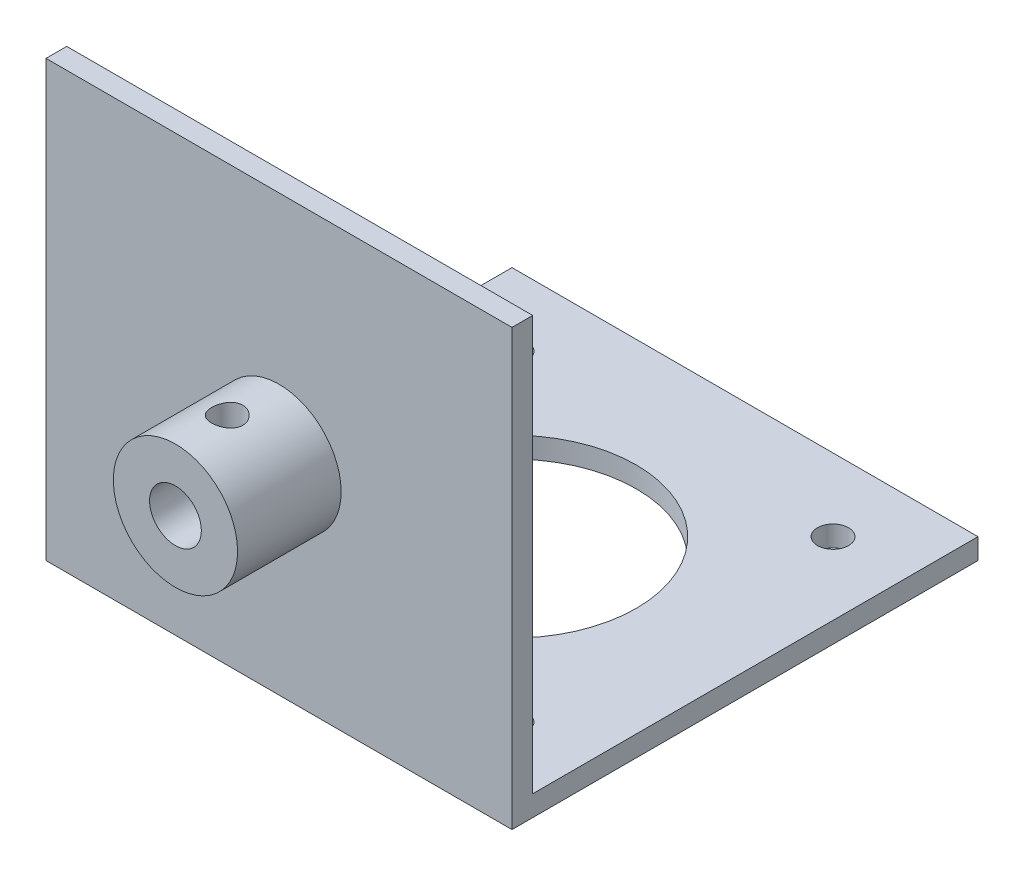
ISO-10303-21;
HEADER;
FILE_DESCRIPTION(('STEP AP214'),'2;1');
FILE_NAME('part.step','',(''),(''),'','','');
FILE_SCHEMA(('AUTOMOTIVE_DESIGN { 1 0 10303 214 1 1 1 1 }'));
ENDSEC;
DATA;
#1=APPLICATION_CONTEXT('core data for automotive mechanical design processes');
#2=APPLICATION_PROTOCOL_DEFINITION('international standard','automotive_design',2000,#1);
#3=PRODUCT_CONTEXT('',#1,'mechanical');
#4=PRODUCT('Part','Part','',(#3));
#5=PRODUCT_RELATED_PRODUCT_CATEGORY('part','',(#4));
#6=PRODUCT_DEFINITION_FORMATION('','',#4);
#7=PRODUCT_DEFINITION_CONTEXT('part definition',#1,'design');
#8=PRODUCT_DEFINITION('design','',#6,#7);
#9=PRODUCT_DEFINITION_SHAPE('','',#8);
#10=(LENGTH_UNIT() NAMED_UNIT(*) SI_UNIT(.MILLI.,.METRE.));
#11=(NAMED_UNIT(*) PLANE_ANGLE_UNIT() SI_UNIT($,.RADIAN.));
#12=(NAMED_UNIT(*) SI_UNIT($,.STERADIAN.) SOLID_ANGLE_UNIT());
#13=UNCERTAINTY_MEASURE_WITH_UNIT(LENGTH_MEASURE(1.E-05),#10,'distance_accuracy_value','');
#14=(GEOMETRIC_REPRESENTATION_CONTEXT(3) GLOBAL_UNCERTAINTY_ASSIGNED_CONTEXT((#13)) GLOBAL_UNIT_ASSIGNED_CONTEXT((#10,
#11,#12)) REPRESENTATION_CONTEXT('',''));
#15=CARTESIAN_POINT('',(0.,0.,0.));
#16=DIRECTION('',(0.,0.,1.));
#17=DIRECTION('',(1.,0.,0.));
#18=AXIS2_PLACEMENT_3D('',#15,#16,#17);
#19=CARTESIAN_POINT('',(0.,2.,-45.));
#20=DIRECTION('',(0.,0.,-1.));
#21=DIRECTION('',(-1.,0.,0.));
#22=AXIS2_PLACEMENT_3D('',#19,#20,#21);
#23=PLANE('',#22);
#24=DIRECTION('',(1.,0.,0.));
#25=VECTOR('',#24,1.);
#26=CARTESIAN_POINT('',(0.,0.,-45.));
#27=LINE('',#26,#25);
#28=CARTESIAN_POINT('',(0.,0.,-45.));
#29=VERTEX_POINT('',#28);
#30=CARTESIAN_POINT('',(45.,0.,-45.));
#31=VERTEX_POINT('',#30);
#32=EDGE_CURVE('E99',#29,#31,#27,.T.);
#33=ORIENTED_EDGE('',*,*,#32,.F.);
#34=DIRECTION('',(0.,-1.,0.));
#35=VECTOR('',#34,1.);
#36=CARTESIAN_POINT('',(0.,2.,-45.));
#37=LINE('',#36,#35);
#38=CARTESIAN_POINT('',(0.,2.,-45.));
#39=VERTEX_POINT('',#38);
#40=EDGE_CURVE('E55',#39,#29,#37,.T.);
#41=ORIENTED_EDGE('',*,*,#40,.F.);
#42=DIRECTION('',(1.,0.,0.));
#43=VECTOR('',#42,1.);
#44=CARTESIAN_POINT('',(0.,2.,-45.));
#45=LINE('',#44,#43);
#46=CARTESIAN_POINT('',(45.,2.,-45.));
#47=VERTEX_POINT('',#46);
#48=EDGE_CURVE('E113',#39,#47,#45,.T.);
#49=ORIENTED_EDGE('',*,*,#48,.T.);
#50=DIRECTION('',(0.,-1.,0.));
#51=VECTOR('',#50,1.);
#52=CARTESIAN_POINT('',(45.,2.,-45.));
#53=LINE('',#52,#51);
#54=EDGE_CURVE('E101',#47,#31,#53,.T.);
#55=ORIENTED_EDGE('',*,*,#54,.T.);
#56=EDGE_LOOP('',(#33,#41,#49,#55));
#57=FACE_BOUND('',#56,.T.);
#58=ADVANCED_FACE('F41',(#57),#23,.T.);
#59=CARTESIAN_POINT('',(0.,2.,0.));
#60=DIRECTION('',(-1.,0.,0.));
#61=DIRECTION('',(0.,0.,1.));
#62=AXIS2_PLACEMENT_3D('',#59,#60,#61);
#63=PLANE('',#62);
#64=DIRECTION('',(0.,0.,-1.));
#65=VECTOR('',#64,1.);
#66=CARTESIAN_POINT('',(0.,0.,0.));
#67=LINE('',#66,#65);
#68=CARTESIAN_POINT('',(0.,0.,0.));
#69=VERTEX_POINT('',#68);
#70=EDGE_CURVE('E91',#69,#29,#67,.T.);
#71=ORIENTED_EDGE('',*,*,#70,.F.);
#72=DIRECTION('',(0.,-1.,0.));
#73=VECTOR('',#72,1.);
#74=CARTESIAN_POINT('',(0.,2.,0.));
#75=LINE('',#74,#73);
#76=CARTESIAN_POINT('',(0.,42.,0.));
#77=VERTEX_POINT('',#76);
#78=EDGE_CURVE('E96',#77,#69,#75,.T.);
#79=ORIENTED_EDGE('',*,*,#78,.F.);
#80=DIRECTION('',(0.,0.,1.));
#81=VECTOR('',#80,1.);
#82=CARTESIAN_POINT('',(0.,42.,0.));
#83=LINE('',#82,#81);
#84=CARTESIAN_POINT('',(0.,42.,-2.));
#85=VERTEX_POINT('',#84);
#86=EDGE_CURVE('E351',#85,#77,#83,.T.);
#87=ORIENTED_EDGE('',*,*,#86,.F.);
#88=DIRECTION('',(0.,-1.,0.));
#89=VECTOR('',#88,1.);
#90=CARTESIAN_POINT('',(0.,42.,-2.));
#91=LINE('',#90,#89);
#92=CARTESIAN_POINT('',(0.,2.,-2.));
#93=VERTEX_POINT('',#92);
#94=EDGE_CURVE('E348',#85,#93,#91,.T.);
#95=ORIENTED_EDGE('',*,*,#94,.T.);
#96=DIRECTION('',(0.,0.,-1.));
#97=VECTOR('',#96,1.);
#98=CARTESIAN_POINT('',(0.,2.,0.));
#99=LINE('',#98,#97);
#100=EDGE_CURVE('E71',#93,#39,#99,.T.);
#101=ORIENTED_EDGE('',*,*,#100,.T.);
#102=ORIENTED_EDGE('',*,*,#40,.T.);
#103=EDGE_LOOP('',(#71,#79,#87,#95,#101,#102));
#104=FACE_BOUND('',#103,.T.);
#105=ADVANCED_FACE('F88',(#104),#63,.T.);
#106=CARTESIAN_POINT('',(0.,2.,0.));
#107=DIRECTION('',(0.,0.,-1.));
#108=DIRECTION('',(-1.,0.,0.));
#109=AXIS2_PLACEMENT_3D('',#106,#107,#108);
#110=PLANE('',#109);
#111=CARTESIAN_POINT('',(22.5,20.,0.));
#112=DIRECTION('',(0.,0.,1.));
#113=DIRECTION('',(1.,0.,0.));
#114=AXIS2_PLACEMENT_3D('',#111,#112,#113);
#115=CIRCLE('',#114,6.);
#116=CARTESIAN_POINT('',(28.5,20.,0.));
#117=VERTEX_POINT('',#116);
#118=EDGE_CURVE('E11',#117,#117,#115,.T.);
#119=ORIENTED_EDGE('',*,*,#118,.F.);
#120=EDGE_LOOP('',(#119));
#121=FACE_BOUND('',#120,.T.);
#122=DIRECTION('',(1.,0.,0.));
#123=VECTOR('',#122,1.);
#124=CARTESIAN_POINT('',(0.,0.,0.));
#125=LINE('',#124,#123);
#126=CARTESIAN_POINT('',(45.,0.,0.));
#127=VERTEX_POINT('',#126);
#128=EDGE_CURVE('E111',#69,#127,#125,.T.);
#129=ORIENTED_EDGE('',*,*,#128,.T.);
#130=DIRECTION('',(0.,-1.,0.));
#131=VECTOR('',#130,1.);
#132=CARTESIAN_POINT('',(45.,2.,0.));
#133=LINE('',#132,#131);
#134=CARTESIAN_POINT('',(45.,42.,0.));
#135=VERTEX_POINT('',#134);
#136=EDGE_CURVE('E124',#135,#127,#133,.T.);
#137=ORIENTED_EDGE('',*,*,#136,.F.);
#138=DIRECTION('',(1.,0.,0.));
#139=VECTOR('',#138,1.);
#140=CARTESIAN_POINT('',(45.,42.,0.));
#141=LINE('',#140,#139);
#142=EDGE_CURVE('E354',#77,#135,#141,.T.);
#143=ORIENTED_EDGE('',*,*,#142,.F.);
#144=ORIENTED_EDGE('',*,*,#78,.T.);
#145=EDGE_LOOP('',(#129,#137,#143,#144));
#146=FACE_BOUND('',#145,.T.);
#147=ADVANCED_FACE('F224',(#121,#146),#110,.F.);
#148=CARTESIAN_POINT('',(45.,2.,0.));
#149=DIRECTION('',(-1.,0.,0.));
#150=DIRECTION('',(0.,0.,1.));
#151=AXIS2_PLACEMENT_3D('',#148,#149,#150);
#152=PLANE('',#151);
#153=DIRECTION('',(0.,0.,-1.));
#154=VECTOR('',#153,1.);
#155=CARTESIAN_POINT('',(45.,0.,0.));
#156=LINE('',#155,#154);
#157=EDGE_CURVE('E106',#127,#31,#156,.T.);
#158=ORIENTED_EDGE('',*,*,#157,.T.);
#159=ORIENTED_EDGE('',*,*,#54,.F.);
#160=DIRECTION('',(0.,0.,-1.));
#161=VECTOR('',#160,1.);
#162=CARTESIAN_POINT('',(45.,2.,0.));
#163=LINE('',#162,#161);
#164=CARTESIAN_POINT('',(45.,2.,-2.));
#165=VERTEX_POINT('',#164);
#166=EDGE_CURVE('E117',#165,#47,#163,.T.);
#167=ORIENTED_EDGE('',*,*,#166,.F.);
#168=DIRECTION('',(0.,-1.,0.));
#169=VECTOR('',#168,1.);
#170=CARTESIAN_POINT('',(45.,42.,-2.));
#171=LINE('',#170,#169);
#172=CARTESIAN_POINT('',(45.,42.,-2.));
#173=VERTEX_POINT('',#172);
#174=EDGE_CURVE('E334',#173,#165,#171,.T.);
#175=ORIENTED_EDGE('',*,*,#174,.F.);
#176=DIRECTION('',(0.,0.,-1.));
#177=VECTOR('',#176,1.);
#178=CARTESIAN_POINT('',(45.,42.,-2.));
#179=LINE('',#178,#177);
#180=EDGE_CURVE('E317',#135,#173,#179,.T.);
#181=ORIENTED_EDGE('',*,*,#180,.F.);
#182=ORIENTED_EDGE('',*,*,#136,.T.);
#183=EDGE_LOOP('',(#158,#159,#167,#175,#181,#182));
#184=FACE_BOUND('',#183,.T.);
#185=ADVANCED_FACE('F218',(#184),#152,.F.);
#186=CARTESIAN_POINT('',(0.,2.,0.));
#187=DIRECTION('',(0.,1.,0.));
#188=DIRECTION('',(0.,0.,1.));
#189=AXIS2_PLACEMENT_3D('',#186,#187,#188);
#190=PLANE('',#189);
#191=DIRECTION('',(-1.,0.,0.));
#192=VECTOR('',#191,1.);
#193=CARTESIAN_POINT('',(0.,2.,-2.));
#194=LINE('',#193,#192);
#195=EDGE_CURVE('E63',#165,#93,#194,.T.);
#196=ORIENTED_EDGE('',*,*,#195,.F.);
#197=ORIENTED_EDGE('',*,*,#166,.T.);
#198=ORIENTED_EDGE('',*,*,#48,.F.);
#199=ORIENTED_EDGE('',*,*,#100,.F.);
#200=EDGE_LOOP('',(#196,#197,#198,#199));
#201=FACE_BOUND('',#200,.T.);
#202=CARTESIAN_POINT('',(22.5,2.,-22.5));
#203=DIRECTION('',(0.,1.,0.));
#204=DIRECTION('',(0.,0.,1.));
#205=AXIS2_PLACEMENT_3D('',#202,#203,#204);
#206=CIRCLE('',#205,12.);
#207=CARTESIAN_POINT('',(22.5,2.,-10.5));
#208=VERTEX_POINT('',#207);
#209=EDGE_CURVE('E329',#208,#208,#206,.T.);
#210=ORIENTED_EDGE('',*,*,#209,.F.);
#211=EDGE_LOOP('',(#210));
#212=FACE_BOUND('',#211,.T.);
#213=CARTESIAN_POINT('',(7.00000000000001,2.,-7.));
#214=DIRECTION('',(0.,1.,0.));
#215=DIRECTION('',(0.,0.,1.));
#216=AXIS2_PLACEMENT_3D('',#213,#214,#215);
#217=CIRCLE('',#216,1.5);
#218=CARTESIAN_POINT('',(7.00000000000001,2.,-5.5));
#219=VERTEX_POINT('',#218);
#220=EDGE_CURVE('E333',#219,#219,#217,.T.);
#221=ORIENTED_EDGE('',*,*,#220,.F.);
#222=EDGE_LOOP('',(#221));
#223=FACE_BOUND('',#222,.T.);
#224=CARTESIAN_POINT('',(38.,2.,-7.));
#225=DIRECTION('',(0.,1.,0.));
#226=DIRECTION('',(0.,0.,1.));
#227=AXIS2_PLACEMENT_3D('',#224,#225,#226);
#228=CIRCLE('',#227,1.5);
#229=CARTESIAN_POINT('',(38.,2.,-5.49999999999999));
#230=VERTEX_POINT('',#229);
#231=EDGE_CURVE('E338',#230,#230,#228,.T.);
#232=ORIENTED_EDGE('',*,*,#231,.F.);
#233=EDGE_LOOP('',(#232));
#234=FACE_BOUND('',#233,.T.);
#235=CARTESIAN_POINT('',(38.,2.,-38.));
#236=DIRECTION('',(0.,1.,0.));
#237=DIRECTION('',(0.,0.,1.));
#238=AXIS2_PLACEMENT_3D('',#235,#236,#237);
#239=CIRCLE('',#238,1.5);
#240=CARTESIAN_POINT('',(38.,2.,-36.5));
#241=VERTEX_POINT('',#240);
#242=EDGE_CURVE('E328',#241,#241,#239,.T.);
#243=ORIENTED_EDGE('',*,*,#242,.F.);
#244=EDGE_LOOP('',(#243));
#245=FACE_BOUND('',#244,.T.);
#246=CARTESIAN_POINT('',(7.00000000000001,2.,-38.));
#247=DIRECTION('',(0.,1.,0.));
#248=DIRECTION('',(0.,0.,1.));
#249=AXIS2_PLACEMENT_3D('',#246,#247,#248);
#250=CIRCLE('',#249,1.5);
#251=CARTESIAN_POINT('',(7.00000000000001,2.,-36.5));
#252=VERTEX_POINT('',#251);
#253=EDGE_CURVE('E135',#252,#252,#250,.T.);
#254=ORIENTED_EDGE('',*,*,#253,.F.);
#255=EDGE_LOOP('',(#254));
#256=FACE_BOUND('',#255,.T.);
#257=ADVANCED_FACE('F215',(#201,#212,#223,#234,#245,#256),#190,.T.);
#258=CARTESIAN_POINT('',(0.,0.,0.));
#259=DIRECTION('',(0.,1.,0.));
#260=DIRECTION('',(0.,0.,1.));
#261=AXIS2_PLACEMENT_3D('',#258,#259,#260);
#262=PLANE('',#261);
#263=CARTESIAN_POINT('',(22.5,0.,-22.5));
#264=DIRECTION('',(0.,1.,0.));
#265=DIRECTION('',(0.,0.,1.));
#266=AXIS2_PLACEMENT_3D('',#263,#264,#265);
#267=CIRCLE('',#266,12.);
#268=CARTESIAN_POINT('',(22.5,0.,-10.5));
#269=VERTEX_POINT('',#268);
#270=EDGE_CURVE('E107',#269,#269,#267,.T.);
#271=ORIENTED_EDGE('',*,*,#270,.T.);
#272=EDGE_LOOP('',(#271));
#273=FACE_BOUND('',#272,.T.);
#274=CARTESIAN_POINT('',(7.00000000000001,0.,-7.));
#275=DIRECTION('',(0.,1.,0.));
#276=DIRECTION('',(0.,0.,1.));
#277=AXIS2_PLACEMENT_3D('',#274,#275,#276);
#278=CIRCLE('',#277,1.5);
#279=CARTESIAN_POINT('',(7.00000000000001,0.,-5.5));
#280=VERTEX_POINT('',#279);
#281=EDGE_CURVE('E143',#280,#280,#278,.T.);
#282=ORIENTED_EDGE('',*,*,#281,.T.);
#283=EDGE_LOOP('',(#282));
#284=FACE_BOUND('',#283,.T.);
#285=CARTESIAN_POINT('',(38.,0.,-7.));
#286=DIRECTION('',(0.,1.,0.));
#287=DIRECTION('',(0.,0.,1.));
#288=AXIS2_PLACEMENT_3D('',#285,#286,#287);
#289=CIRCLE('',#288,1.5);
#290=CARTESIAN_POINT('',(38.,0.,-5.49999999999999));
#291=VERTEX_POINT('',#290);
#292=EDGE_CURVE('E139',#291,#291,#289,.T.);
#293=ORIENTED_EDGE('',*,*,#292,.T.);
#294=EDGE_LOOP('',(#293));
#295=FACE_BOUND('',#294,.T.);
#296=CARTESIAN_POINT('',(38.,0.,-38.));
#297=DIRECTION('',(0.,1.,0.));
#298=DIRECTION('',(0.,0.,1.));
#299=AXIS2_PLACEMENT_3D('',#296,#297,#298);
#300=CIRCLE('',#299,1.5);
#301=CARTESIAN_POINT('',(38.,0.,-36.5));
#302=VERTEX_POINT('',#301);
#303=EDGE_CURVE('E134',#302,#302,#300,.T.);
#304=ORIENTED_EDGE('',*,*,#303,.T.);
#305=EDGE_LOOP('',(#304));
#306=FACE_BOUND('',#305,.T.);
#307=CARTESIAN_POINT('',(7.00000000000001,0.,-38.));
#308=DIRECTION('',(0.,1.,0.));
#309=DIRECTION('',(0.,0.,1.));
#310=AXIS2_PLACEMENT_3D('',#307,#308,#309);
#311=CIRCLE('',#310,1.5);
#312=CARTESIAN_POINT('',(7.00000000000001,0.,-36.5));
#313=VERTEX_POINT('',#312);
#314=EDGE_CURVE('E130',#313,#313,#311,.T.);
#315=ORIENTED_EDGE('',*,*,#314,.T.);
#316=EDGE_LOOP('',(#315));
#317=FACE_BOUND('',#316,.T.);
#318=ORIENTED_EDGE('',*,*,#32,.T.);
#319=ORIENTED_EDGE('',*,*,#157,.F.);
#320=ORIENTED_EDGE('',*,*,#128,.F.);
#321=ORIENTED_EDGE('',*,*,#70,.T.);
#322=EDGE_LOOP('',(#318,#319,#320,#321));
#323=FACE_BOUND('',#322,.T.);
#324=ADVANCED_FACE('F110',(#273,#284,#295,#306,#317,#323),#262,.F.);
#325=CARTESIAN_POINT('',(7.00000000000001,-8.,-38.));
#326=DIRECTION('',(0.,1.,0.));
#327=DIRECTION('',(0.,0.,1.));
#328=AXIS2_PLACEMENT_3D('',#325,#326,#327);
#329=CYLINDRICAL_SURFACE('',#328,1.5);
#330=ORIENTED_EDGE('',*,*,#253,.T.);
#331=EDGE_LOOP('',(#330));
#332=FACE_BOUND('',#331,.T.);
#333=ORIENTED_EDGE('',*,*,#314,.F.);
#334=EDGE_LOOP('',(#333));
#335=FACE_BOUND('',#334,.T.);
#336=ADVANCED_FACE('F200',(#332,#335),#329,.F.);
#337=CARTESIAN_POINT('',(38.,-8.,-38.));
#338=DIRECTION('',(0.,1.,0.));
#339=DIRECTION('',(0.,0.,1.));
#340=AXIS2_PLACEMENT_3D('',#337,#338,#339);
#341=CYLINDRICAL_SURFACE('',#340,1.5);
#342=ORIENTED_EDGE('',*,*,#242,.T.);
#343=EDGE_LOOP('',(#342));
#344=FACE_BOUND('',#343,.T.);
#345=ORIENTED_EDGE('',*,*,#303,.F.);
#346=EDGE_LOOP('',(#345));
#347=FACE_BOUND('',#346,.T.);
#348=ADVANCED_FACE('F196',(#344,#347),#341,.F.);
#349=CARTESIAN_POINT('',(38.,-8.,-7.));
#350=DIRECTION('',(0.,1.,0.));
#351=DIRECTION('',(0.,0.,1.));
#352=AXIS2_PLACEMENT_3D('',#349,#350,#351);
#353=CYLINDRICAL_SURFACE('',#352,1.5);
#354=ORIENTED_EDGE('',*,*,#231,.T.);
#355=EDGE_LOOP('',(#354));
#356=FACE_BOUND('',#355,.T.);
#357=ORIENTED_EDGE('',*,*,#292,.F.);
#358=EDGE_LOOP('',(#357));
#359=FACE_BOUND('',#358,.T.);
#360=ADVANCED_FACE('F199',(#356,#359),#353,.F.);
#361=CARTESIAN_POINT('',(7.00000000000001,-8.,-7.));
#362=DIRECTION('',(0.,1.,0.));
#363=DIRECTION('',(0.,0.,1.));
#364=AXIS2_PLACEMENT_3D('',#361,#362,#363);
#365=CYLINDRICAL_SURFACE('',#364,1.5);
#366=ORIENTED_EDGE('',*,*,#220,.T.);
#367=EDGE_LOOP('',(#366));
#368=FACE_BOUND('',#367,.T.);
#369=ORIENTED_EDGE('',*,*,#281,.F.);
#370=EDGE_LOOP('',(#369));
#371=FACE_BOUND('',#370,.T.);
#372=ADVANCED_FACE('F204',(#368,#371),#365,.F.);
#373=CARTESIAN_POINT('',(22.5,-8.,-22.5));
#374=DIRECTION('',(0.,1.,0.));
#375=DIRECTION('',(0.,0.,1.));
#376=AXIS2_PLACEMENT_3D('',#373,#374,#375);
#377=CYLINDRICAL_SURFACE('',#376,12.);
#378=ORIENTED_EDGE('',*,*,#209,.T.);
#379=EDGE_LOOP('',(#378));
#380=FACE_BOUND('',#379,.T.);
#381=ORIENTED_EDGE('',*,*,#270,.F.);
#382=EDGE_LOOP('',(#381));
#383=FACE_BOUND('',#382,.T.);
#384=ADVANCED_FACE('F194',(#380,#383),#377,.F.);
#385=CARTESIAN_POINT('',(0.,42.,-2.));
#386=DIRECTION('',(0.,0.,1.));
#387=DIRECTION('',(1.,0.,0.));
#388=AXIS2_PLACEMENT_3D('',#385,#386,#387);
#389=PLANE('',#388);
#390=ORIENTED_EDGE('',*,*,#195,.T.);
#391=ORIENTED_EDGE('',*,*,#94,.F.);
#392=DIRECTION('',(-1.,0.,0.));
#393=VECTOR('',#392,1.);
#394=CARTESIAN_POINT('',(0.,42.,-2.));
#395=LINE('',#394,#393);
#396=EDGE_CURVE('E358',#173,#85,#395,.T.);
#397=ORIENTED_EDGE('',*,*,#396,.F.);
#398=ORIENTED_EDGE('',*,*,#174,.T.);
#399=EDGE_LOOP('',(#390,#391,#397,#398));
#400=FACE_BOUND('',#399,.T.);
#401=ADVANCED_FACE('F190',(#400),#389,.F.);
#402=CARTESIAN_POINT('',(0.,42.,0.));
#403=DIRECTION('',(0.,-1.,0.));
#404=DIRECTION('',(0.,0.,-1.));
#405=AXIS2_PLACEMENT_3D('',#402,#403,#404);
#406=PLANE('',#405);
#407=ORIENTED_EDGE('',*,*,#142,.T.);
#408=ORIENTED_EDGE('',*,*,#180,.T.);
#409=ORIENTED_EDGE('',*,*,#396,.T.);
#410=ORIENTED_EDGE('',*,*,#86,.T.);
#411=EDGE_LOOP('',(#407,#408,#409,#410));
#412=FACE_BOUND('',#411,.T.);
#413=ADVANCED_FACE('F185',(#412),#406,.F.);
#414=CARTESIAN_POINT('',(22.5,20.,10.));
#415=DIRECTION('',(0.,0.,-1.));
#416=DIRECTION('',(-1.,0.,0.));
#417=AXIS2_PLACEMENT_3D('',#414,#415,#416);
#418=CYLINDRICAL_SURFACE('',#417,2.5);
#419=CARTESIAN_POINT('',(22.5,17.5,6.5));
#420=CARTESIAN_POINT('',(22.576729833462,17.5000037421027,6.49999590899012));
#421=CARTESIAN_POINT('',(22.6535823206442,17.5035709538499,6.49407132907374));
#422=CARTESIAN_POINT('',(22.8049755095307,17.5175009639143,6.47067568048467));
#423=CARTESIAN_POINT('',(22.879510034596,17.5278805196728,6.45317613814578));
#424=CARTESIAN_POINT('',(23.0237518277908,17.5543844194551,6.40761363883314));
#425=CARTESIAN_POINT('',(23.0934810282266,17.5704802672706,6.37960304183684));
#426=CARTESIAN_POINT('',(23.2270303182147,17.6070463237359,6.31413966685897));
#427=CARTESIAN_POINT('',(23.2908518694164,17.6275154461975,6.27668923303125));
#428=CARTESIAN_POINT('',(23.4162992789993,17.6729463928091,6.19022517329142));
#429=CARTESIAN_POINT('',(23.4773840200814,17.6981320780402,6.14054630464861));
#430=CARTESIAN_POINT('',(23.5908827041189,17.7496956072037,6.03253279617173));
#431=CARTESIAN_POINT('',(23.6432853494811,17.7760749484643,5.97418706281268));
#432=CARTESIAN_POINT('',(23.7444499676297,17.8308893300409,5.84207648950327));
#433=CARTESIAN_POINT('',(23.7919776637881,17.8591798229635,5.76729822901871));
#434=CARTESIAN_POINT('',(23.873614377649,17.9106169858788,5.60915342675689));
#435=CARTESIAN_POINT('',(23.9077451733516,17.9337719772606,5.52580110375243));
#436=CARTESIAN_POINT('',(23.9544060171422,17.9664537033907,5.37340354934676));
#437=CARTESIAN_POINT('',(23.9701619724683,17.9779211686241,5.30576400138968));
#438=CARTESIAN_POINT('',(23.9921617234047,17.994096917045,5.16819628416964));
#439=CARTESIAN_POINT('',(23.9984173455684,17.9988136035624,5.09827107124551));
#440=CARTESIAN_POINT('',(24.0010550879601,18.0007907753614,4.95798850578267));
#441=CARTESIAN_POINT('',(23.9974178340842,17.9980366298728,4.8876305749068));
#442=CARTESIAN_POINT('',(23.9804606047883,17.9854673855626,4.74872122457241));
#443=CARTESIAN_POINT('',(23.967133346201,17.9756469756777,4.68017120415256));
#444=CARTESIAN_POINT('',(23.9317392188179,17.9504681305574,4.54746975787189));
#445=CARTESIAN_POINT('',(23.9097874866609,17.9351828834746,4.48327294607552));
#446=CARTESIAN_POINT('',(23.8579506177084,17.9007294864917,4.35930500907188));
#447=CARTESIAN_POINT('',(23.828062572597,17.8815599137654,4.29953551657607));
#448=CARTESIAN_POINT('',(23.7551798318458,17.8374467273101,4.1750159028772));
#449=CARTESIAN_POINT('',(23.7108072439772,17.8120795662701,4.11122190704507));
#450=CARTESIAN_POINT('',(23.61291092784,17.7606940023562,3.99132351633298));
#451=CARTESIAN_POINT('',(23.5593784510058,17.7346749973785,3.93522656602349));
#452=CARTESIAN_POINT('',(23.435811834383,17.6806449504168,3.82438701817824));
#453=CARTESIAN_POINT('',(23.364517682705,17.6528616373147,3.77092269398401));
#454=CARTESIAN_POINT('',(23.212276050459,17.6022757156602,3.67687795280209));
#455=CARTESIAN_POINT('',(23.1313337639436,17.5794704457448,3.63629064621005));
#456=CARTESIAN_POINT('',(22.9671975852682,17.5426960793385,3.5720678172041));
#457=CARTESIAN_POINT('',(22.8844676241736,17.528260425603,3.54752464428408));
#458=CARTESIAN_POINT('',(22.7150478951446,17.5078115718645,3.51298880259462));
#459=CARTESIAN_POINT('',(22.6283630056613,17.5017882704726,3.50297868224642));
#460=CARTESIAN_POINT('',(22.4662853856226,17.4990942962539,3.49849215232169));
#461=CARTESIAN_POINT('',(22.3909575265813,17.5012647828571,3.50209114491483));
#462=CARTESIAN_POINT('',(22.2421705980139,17.5122128791295,3.52042585307192));
#463=CARTESIAN_POINT('',(22.1687114906239,17.5209903548196,3.53516134280581));
#464=CARTESIAN_POINT('',(22.0274250678424,17.5440520755781,3.57454343281246));
#465=CARTESIAN_POINT('',(21.9595042490715,17.5581972433744,3.59894034907347));
#466=CARTESIAN_POINT('',(21.8287342509127,17.5908611913716,3.65667737636527));
#467=CARTESIAN_POINT('',(21.7658860750361,17.6093808341349,3.69001925134667));
#468=CARTESIAN_POINT('',(21.6399937371761,17.6515450376264,3.7685569792087));
#469=CARTESIAN_POINT('',(21.5776058495432,17.6755219726012,3.81462382907839));
#470=CARTESIAN_POINT('',(21.4609739686899,17.7252573442527,3.91539139348861));
#471=CARTESIAN_POINT('',(21.4067395972626,17.7510178341364,3.97010215485253));
#472=CARTESIAN_POINT('',(21.3006800326442,17.8055457609011,4.09491039003715));
#473=CARTESIAN_POINT('',(21.2500898036909,17.8342675825371,4.1660838854655));
#474=CARTESIAN_POINT('',(21.1615476108433,17.8878381793329,4.3172160245682));
#475=CARTESIAN_POINT('',(21.1235823323022,17.9126910200231,4.39716529389278));
#476=CARTESIAN_POINT('',(21.0685742120422,17.9501509075948,4.54624302230669));
#477=CARTESIAN_POINT('',(21.0487837466381,17.9642434067127,4.61398031235859));
#478=CARTESIAN_POINT('',(21.0188633609403,17.9859039425646,4.7525320780801));
#479=CARTESIAN_POINT('',(21.0087200470237,17.9934810235728,4.82334214432783));
#480=CARTESIAN_POINT('',(20.9986586958337,18.0009955338373,4.96637694759703));
#481=CARTESIAN_POINT('',(20.9987791089213,18.0009042355406,5.03860599068704));
#482=CARTESIAN_POINT('',(21.0093352704067,17.9930228210715,5.18189443560946));
#483=CARTESIAN_POINT('',(21.0197766278424,17.9852285186118,5.2529531800806));
#484=CARTESIAN_POINT('',(21.0495982585109,17.9636681475702,5.38848841757219));
#485=CARTESIAN_POINT('',(21.0685236315465,17.9502078819442,5.45311709430687));
#486=CARTESIAN_POINT('',(21.1143675792301,17.9189449803985,5.57833725447422));
#487=CARTESIAN_POINT('',(21.1412891641152,17.9011407095952,5.63892720696056));
#488=CARTESIAN_POINT('',(21.2071075444427,17.8598700944908,5.76431985722078));
#489=CARTESIAN_POINT('',(21.2472083232425,17.8359541241736,5.82834110385431));
#490=CARTESIAN_POINT('',(21.3362430161092,17.7867987296923,5.94938007261729));
#491=CARTESIAN_POINT('',(21.385184203922,17.7615582279498,6.00639196215256));
#492=CARTESIAN_POINT('',(21.4999022257427,17.7077430970852,6.12135094913167));
#493=CARTESIAN_POINT('',(21.5671231806861,17.6792969133634,6.17793107489619));
#494=CARTESIAN_POINT('',(21.7115375655544,17.6263457112763,6.27909785586331));
#495=CARTESIAN_POINT('',(21.7887345554985,17.6018421068906,6.32368021198479));
#496=CARTESIAN_POINT('',(21.9488747691985,17.5601442134561,6.39778580757374));
#497=CARTESIAN_POINT('',(22.0315699130428,17.5427492252021,6.42772806492683));
#498=CARTESIAN_POINT('',(22.2020266938812,17.5163372699875,6.47272469521098));
#499=CARTESIAN_POINT('',(22.2897679003514,17.5072887412852,6.48783516785699));
#500=CARTESIAN_POINT('',(22.3984419030825,17.5019799883181,6.49669745470866));
#501=CARTESIAN_POINT('',(22.4187237409717,17.5012388534364,6.4979344173061));
#502=CARTESIAN_POINT('',(22.4593341793129,17.5002483548263,6.49958624637086));
#503=CARTESIAN_POINT('',(22.4796627813624,17.4999990081568,6.5000010843209));
#504=CARTESIAN_POINT('',(22.5,17.5,6.5));
#505=B_SPLINE_CURVE_WITH_KNOTS('',3,(#419,#420,#421,#422,#423,#424,#425,#426,#427,#428,#429,
#430,#431,#432,#433,#434,#435,#436,#437,#438,#439,#440,#441,#442,#443,#444,#445,#446,#447,#448,
#449,#450,#451,#452,#453,#454,#455,#456,#457,#458,#459,#460,#461,#462,#463,#464,#465,#466,#467,
#468,#469,#470,#471,#472,#473,#474,#475,#476,#477,#478,#479,#480,#481,#482,#483,#484,#485,#486,
#487,#488,#489,#490,#491,#492,#493,#494,#495,#496,#497,#498,#499,#500,#501,#502,#503,#504),
.UNSPECIFIED.,.T.,.F.,(4,2,2,2,2,2,2,2,2,2,2,2,2,2,2,2,2,2,2,2,2,2,2,2,2,2,2,2,2,2,2,2,2,2,2,2,
2,2,2,2,2,2,4),(0.,0.23010223754865,0.460772627520013,0.690308884600013,0.919788197992274,
1.16681590732472,1.414162579348,1.69183813189807,1.96906040692092,2.17933829855633,
2.38935420916578,2.59978170870726,2.81036753273872,3.01823267593207,3.22617409809869,
3.47046995225163,3.71500044803675,3.99360957884691,4.27206939275325,4.5329679069656,
4.79355286918236,5.01875602722426,5.24395461863455,5.46367785689771,5.68344445659025,
5.92601365818361,6.16886690081836,6.44336762428009,6.71757792616456,6.93257787314692,
7.14727888733318,7.36278425777433,7.57840681155725,7.78364098331142,7.98895251523035,
8.22578610052286,8.46281544370208,8.73854311775519,9.01436946031985,9.28175654462677,
9.54812832184448,9.60911473335177,9.6701032602764),.UNSPECIFIED.);
#506=CARTESIAN_POINT('',(22.5,17.5,6.5));
#507=VERTEX_POINT('',#506);
#508=EDGE_CURVE('E176',#507,#507,#505,.T.);
#509=ORIENTED_EDGE('',*,*,#508,.F.);
#510=EDGE_LOOP('',(#509));
#511=FACE_BOUND('',#510,.T.);
#512=CARTESIAN_POINT('',(22.5,22.5,6.5));
#513=CARTESIAN_POINT('',(22.423270166538,22.4999962578973,6.49999590899012));
#514=CARTESIAN_POINT('',(22.3464176793558,22.4964290461501,6.49407132907374));
#515=CARTESIAN_POINT('',(22.1950244904693,22.4824990360857,6.47067568048467));
#516=CARTESIAN_POINT('',(22.120489965404,22.4721194803272,6.45317613814578));
#517=CARTESIAN_POINT('',(21.9762481722092,22.4456155805449,6.40761363883314));
#518=CARTESIAN_POINT('',(21.9065189717734,22.4295197327294,6.37960304183684));
#519=CARTESIAN_POINT('',(21.7729696817853,22.3929536762641,6.31413966685897));
#520=CARTESIAN_POINT('',(21.7091481305836,22.3724845538025,6.27668923303125));
#521=CARTESIAN_POINT('',(21.5837007210007,22.3270536071909,6.19022517329142));
#522=CARTESIAN_POINT('',(21.5226159799186,22.3018679219598,6.14054630464861));
#523=CARTESIAN_POINT('',(21.4091172958811,22.2503043927963,6.03253279617173));
#524=CARTESIAN_POINT('',(21.3567146505189,22.2239250515357,5.97418706281268));
#525=CARTESIAN_POINT('',(21.2555500323703,22.1691106699591,5.84207648950327));
#526=CARTESIAN_POINT('',(21.2080223362119,22.1408201770365,5.76729822901871));
#527=CARTESIAN_POINT('',(21.126385622351,22.0893830141212,5.60915342675688));
#528=CARTESIAN_POINT('',(21.0922548266484,22.0662280227394,5.52580110375243));
#529=CARTESIAN_POINT('',(21.0455939828578,22.0335462966093,5.37340354934676));
#530=CARTESIAN_POINT('',(21.0298380275317,22.0220788313759,5.30576400138968));
#531=CARTESIAN_POINT('',(21.0078382765953,22.005903082955,5.16819628416963));
#532=CARTESIAN_POINT('',(21.0015826544316,22.0011863964376,5.0982710712455));
#533=CARTESIAN_POINT('',(20.9989449120399,21.9992092246386,4.95798850578266));
#534=CARTESIAN_POINT('',(21.0025821659158,22.0019633701272,4.8876305749068));
#535=CARTESIAN_POINT('',(21.0195393952117,22.0145326144374,4.74872122457241));
#536=CARTESIAN_POINT('',(21.032866653799,22.0243530243223,4.68017120415256));
#537=CARTESIAN_POINT('',(21.0682607811821,22.0495318694426,4.5474697578719));
#538=CARTESIAN_POINT('',(21.0902125133391,22.0648171165254,4.48327294607552));
#539=CARTESIAN_POINT('',(21.1420493822916,22.0992705135083,4.35930500907188));
#540=CARTESIAN_POINT('',(21.171937427403,22.1184400862346,4.29953551657608));
#541=CARTESIAN_POINT('',(21.2448201681542,22.1625532726898,4.1750159028772));
#542=CARTESIAN_POINT('',(21.2891927560228,22.1879204337299,4.11122190704508));
#543=CARTESIAN_POINT('',(21.38708907216,22.2393059976438,3.99132351633299));
#544=CARTESIAN_POINT('',(21.4406215489942,22.2653250026215,3.9352265660235));
#545=CARTESIAN_POINT('',(21.564188165617,22.3193550495832,3.82438701817825));
#546=CARTESIAN_POINT('',(21.635482317295,22.3471383626853,3.77092269398401));
#547=CARTESIAN_POINT('',(21.787723949541,22.3977242843398,3.67687795280209));
#548=CARTESIAN_POINT('',(21.8686662360564,22.4205295542552,3.63629064621005));
#549=CARTESIAN_POINT('',(22.0328024147318,22.4573039206615,3.5720678172041));
#550=CARTESIAN_POINT('',(22.1155323758264,22.471739574397,3.54752464428409));
#551=CARTESIAN_POINT('',(22.2849521048554,22.4921884281355,3.51298880259462));
#552=CARTESIAN_POINT('',(22.3716369943387,22.4982117295274,3.50297868224642));
#553=CARTESIAN_POINT('',(22.5337146143774,22.5009057037461,3.49849215232169));
#554=CARTESIAN_POINT('',(22.6090424734187,22.4987352171429,3.50209114491483));
#555=CARTESIAN_POINT('',(22.7578294019861,22.4877871208705,3.52042585307192));
#556=CARTESIAN_POINT('',(22.8312885093761,22.4790096451804,3.53516134280581));
#557=CARTESIAN_POINT('',(22.9725749321576,22.4559479244219,3.57454343281246));
#558=CARTESIAN_POINT('',(23.0404957509285,22.4418027566256,3.59894034907347));
#559=CARTESIAN_POINT('',(23.1712657490873,22.4091388086284,3.65667737636527));
#560=CARTESIAN_POINT('',(23.2341139249639,22.3906191658651,3.69001925134667));
#561=CARTESIAN_POINT('',(23.3600062628239,22.3484549623736,3.76855697920871));
#562=CARTESIAN_POINT('',(23.4223941504568,22.3244780273988,3.81462382907839));
#563=CARTESIAN_POINT('',(23.5390260313101,22.2747426557473,3.91539139348862));
#564=CARTESIAN_POINT('',(23.5932604027374,22.2489821658636,3.97010215485254));
#565=CARTESIAN_POINT('',(23.6993199673558,22.1944542390989,4.09491039003716));
#566=CARTESIAN_POINT('',(23.7499101963091,22.1657324174629,4.16608388546551));
#567=CARTESIAN_POINT('',(23.8384523891567,22.1121618206671,4.31721602456821));
#568=CARTESIAN_POINT('',(23.8764176676978,22.0873089799769,4.39716529389279));
#569=CARTESIAN_POINT('',(23.9314257879578,22.0498490924052,4.54624302230669));
#570=CARTESIAN_POINT('',(23.9512162533619,22.0357565932873,4.61398031235859));
#571=CARTESIAN_POINT('',(23.9811366390597,22.0140960574354,4.7525320780801));
#572=CARTESIAN_POINT('',(23.9912799529763,22.0065189764272,4.82334214432783));
#573=CARTESIAN_POINT('',(24.0013413041663,21.9990044661627,4.96637694759703));
#574=CARTESIAN_POINT('',(24.0012208910787,21.9990957644594,5.03860599068704));
#575=CARTESIAN_POINT('',(23.9906647295933,22.0069771789285,5.18189443560946));
#576=CARTESIAN_POINT('',(23.9802233721576,22.0147714813882,5.25295318008059));
#577=CARTESIAN_POINT('',(23.9504017414891,22.0363318524298,5.38848841757218));
#578=CARTESIAN_POINT('',(23.9314763684535,22.0497921180558,5.45311709430687));
#579=CARTESIAN_POINT('',(23.8856324207699,22.0810550196015,5.57833725447421));
#580=CARTESIAN_POINT('',(23.8587108358848,22.0988592904048,5.63892720696055));
#581=CARTESIAN_POINT('',(23.7928924555573,22.1401299055092,5.76431985722077));
#582=CARTESIAN_POINT('',(23.7527916767575,22.1640458758264,5.8283411038543));
#583=CARTESIAN_POINT('',(23.6637569838909,22.2132012703077,5.94938007261728));
#584=CARTESIAN_POINT('',(23.614815796078,22.2384417720502,6.00639196215255));
#585=CARTESIAN_POINT('',(23.5000977742573,22.2922569029148,6.12135094913167));
#586=CARTESIAN_POINT('',(23.4328768193139,22.3207030866366,6.17793107489618));
#587=CARTESIAN_POINT('',(23.2884624344456,22.3736542887237,6.2790978558633));
#588=CARTESIAN_POINT('',(23.2112654445015,22.3981578931094,6.32368021198479));
#589=CARTESIAN_POINT('',(23.0511252308015,22.4398557865439,6.39778580757373));
#590=CARTESIAN_POINT('',(22.9684300869572,22.4572507747979,6.42772806492683));
#591=CARTESIAN_POINT('',(22.7979733061188,22.4836627300125,6.47272469521097));
#592=CARTESIAN_POINT('',(22.7102320996486,22.4927112587148,6.48783516785699));
#593=CARTESIAN_POINT('',(22.6015580969175,22.4980200116819,6.49669745470866));
#594=CARTESIAN_POINT('',(22.5812762590283,22.4987611465636,6.4979344173061));
#595=CARTESIAN_POINT('',(22.5406658206871,22.4997516451737,6.49958624637086));
#596=CARTESIAN_POINT('',(22.5203372186376,22.5000009918432,6.5000010843209));
#597=CARTESIAN_POINT('',(22.5,22.5,6.5));
#598=B_SPLINE_CURVE_WITH_KNOTS('',3,(#512,#513,#514,#515,#516,#517,#518,#519,#520,#521,#522,
#523,#524,#525,#526,#527,#528,#529,#530,#531,#532,#533,#534,#535,#536,#537,#538,#539,#540,#541,
#542,#543,#544,#545,#546,#547,#548,#549,#550,#551,#552,#553,#554,#555,#556,#557,#558,#559,#560,
#561,#562,#563,#564,#565,#566,#567,#568,#569,#570,#571,#572,#573,#574,#575,#576,#577,#578,#579,
#580,#581,#582,#583,#584,#585,#586,#587,#588,#589,#590,#591,#592,#593,#594,#595,#596,#597),
.UNSPECIFIED.,.T.,.F.,(4,2,2,2,2,2,2,2,2,2,2,2,2,2,2,2,2,2,2,2,2,2,2,2,2,2,2,2,2,2,2,2,2,2,2,2,
2,2,2,2,2,2,4),(0.,0.23010223754865,0.460772627520013,0.690308884600013,0.919788197992278,
1.16681590732473,1.41416257934801,1.69183813189808,1.96906040692092,2.17933829855634,
2.38935420916578,2.59978170870726,2.81036753273872,3.01823267593207,3.22617409809868,
3.47046995225162,3.71500044803674,3.99360957884691,4.27206939275324,4.5329679069656,
4.79355286918236,5.01875602722426,5.24395461863455,5.46367785689772,5.68344445659025,
5.92601365818362,6.16886690081836,6.4433676242801,6.71757792616456,6.93257787314693,
7.14727888733319,7.36278425777433,7.57840681155725,7.78364098331141,7.98895251523034,
8.22578610052285,8.46281544370207,8.73854311775518,9.01436946031984,9.28175654462676,
9.54812832184448,9.60911473335177,9.67010326027641),.UNSPECIFIED.);
#599=CARTESIAN_POINT('',(22.5,22.5,6.5));
#600=VERTEX_POINT('',#599);
#601=EDGE_CURVE('E170',#600,#600,#598,.T.);
#602=ORIENTED_EDGE('',*,*,#601,.F.);
#603=EDGE_LOOP('',(#602));
#604=FACE_BOUND('',#603,.T.);
#605=CARTESIAN_POINT('',(22.5,20.,10.));
#606=DIRECTION('',(0.,0.,1.));
#607=DIRECTION('',(1.,0.,0.));
#608=AXIS2_PLACEMENT_3D('',#605,#606,#607);
#609=CIRCLE('',#608,2.5);
#610=CARTESIAN_POINT('',(25.,20.,10.));
#611=VERTEX_POINT('',#610);
#612=EDGE_CURVE('E370',#611,#611,#609,.T.);
#613=ORIENTED_EDGE('',*,*,#612,.T.);
#614=EDGE_LOOP('',(#613));
#615=FACE_BOUND('',#614,.T.);
#616=CARTESIAN_POINT('',(22.5,20.,0.));
#617=DIRECTION('',(0.,0.,1.));
#618=DIRECTION('',(1.,0.,0.));
#619=AXIS2_PLACEMENT_3D('',#616,#617,#618);
#620=CIRCLE('',#619,2.5);
#621=CARTESIAN_POINT('',(25.,20.,0.));
#622=VERTEX_POINT('',#621);
#623=EDGE_CURVE('E366',#622,#622,#620,.T.);
#624=ORIENTED_EDGE('',*,*,#623,.F.);
#625=EDGE_LOOP('',(#624));
#626=FACE_BOUND('',#625,.T.);
#627=ADVANCED_FACE('F181',(#511,#604,#615,#626),#418,.F.);
#628=CARTESIAN_POINT('',(22.5,20.,10.));
#629=DIRECTION('',(0.,0.,-1.));
#630=DIRECTION('',(-1.,0.,0.));
#631=AXIS2_PLACEMENT_3D('',#628,#629,#630);
#632=CYLINDRICAL_SURFACE('',#631,6.);
#633=CARTESIAN_POINT('',(22.5,14.,6.5));
#634=CARTESIAN_POINT('',(22.5828760886697,14.0000014013199,6.49999767426184));
#635=CARTESIAN_POINT('',(22.6657781578308,14.0017342186817,6.49310844922621));
#636=CARTESIAN_POINT('',(22.8292063237705,14.0084788617011,6.465774848693));
#637=CARTESIAN_POINT('',(22.9097310468707,14.0134925458003,6.44532279046215));
#638=CARTESIAN_POINT('',(23.0660208721826,14.0262437366796,6.39156074653791));
#639=CARTESIAN_POINT('',(23.14179156343,14.0339779715791,6.35826620128472));
#640=CARTESIAN_POINT('',(23.2866721319044,14.0513465619241,6.27981860995517));
#641=CARTESIAN_POINT('',(23.3557817843488,14.0609809814595,6.23466516388106));
#642=CARTESIAN_POINT('',(23.4868019273009,14.081325864082,6.13279921034579));
#643=CARTESIAN_POINT('',(23.5485556900611,14.0920529285147,6.07588842504082));
#644=CARTESIAN_POINT('',(23.6617489272033,14.1132637988247,5.95254779509109));
#645=CARTESIAN_POINT('',(23.7131872369491,14.1237475771165,5.8861168770535));
#646=CARTESIAN_POINT('',(23.805026542799,14.1434522430029,5.74440477326256));
#647=CARTESIAN_POINT('',(23.8452522159254,14.152652055294,5.6690067691896));
#648=CARTESIAN_POINT('',(23.9123969085505,14.1685050518778,5.51225158834164));
#649=CARTESIAN_POINT('',(23.9393180554393,14.1751586432721,5.43089536667424));
#650=CARTESIAN_POINT('',(23.9785548368043,14.1849952328245,5.26625650179753));
#651=CARTESIAN_POINT('',(23.9911522683333,14.1882450892457,5.1830451039502));
#652=CARTESIAN_POINT('',(24.0022617750679,14.1911063746226,5.01563143098602));
#653=CARTESIAN_POINT('',(24.000776141818,14.1907183955136,4.93142931930139));
#654=CARTESIAN_POINT('',(23.9839865246393,14.1864079450338,4.76658419225552));
#655=CARTESIAN_POINT('',(23.9690183401905,14.1825713699812,4.6859043785349));
#656=CARTESIAN_POINT('',(23.9262241869031,14.1719329032352,4.52823894908871));
#657=CARTESIAN_POINT('',(23.8983973020694,14.165130800293,4.45125359697102));
#658=CARTESIAN_POINT('',(23.8303894779372,14.1492488609581,4.30226198374793));
#659=CARTESIAN_POINT('',(23.7900866672329,14.1401467253058,4.23031382821045));
#660=CARTESIAN_POINT('',(23.698356276015,14.1207028915361,4.09408129024316));
#661=CARTESIAN_POINT('',(23.6469267488088,14.1103609766526,4.02979825193274));
#662=CARTESIAN_POINT('',(23.5326634246812,14.0892411946022,3.9087963843056));
#663=CARTESIAN_POINT('',(23.4695462581659,14.0784593052203,3.85234550993865));
#664=CARTESIAN_POINT('',(23.3346119175037,14.0579403442121,3.75077875753609));
#665=CARTESIAN_POINT('',(23.2627944777079,14.0482033045058,3.70566322573643));
#666=CARTESIAN_POINT('',(23.1121158886814,14.0308226790582,3.62794941377561));
#667=CARTESIAN_POINT('',(23.0332313932086,14.0231863987227,3.59539465974557));
#668=CARTESIAN_POINT('',(22.8708760081429,14.0109208300858,3.54408269429043));
#669=CARTESIAN_POINT('',(22.7874059991505,14.0062909666072,3.52532284358186));
#670=CARTESIAN_POINT('',(22.62053997039,14.0006450072863,3.50254243444116));
#671=CARTESIAN_POINT('',(22.5371967199882,13.9995394649172,3.4981569739247));
#672=CARTESIAN_POINT('',(22.3709671251985,14.0008119518555,3.50324900205549));
#673=CARTESIAN_POINT('',(22.2880807403554,14.0031896675815,3.51272524279913));
#674=CARTESIAN_POINT('',(22.1263857312235,14.0111041887264,3.54497090839138));
#675=CARTESIAN_POINT('',(22.0475348810312,14.0165936581419,3.56754126347699));
#676=CARTESIAN_POINT('',(21.8947427075475,14.0301129336587,3.62510708402845));
#677=CARTESIAN_POINT('',(21.8208018809674,14.0381429963011,3.66010380431317));
#678=CARTESIAN_POINT('',(21.6784768655702,14.0560669207369,3.74223612887473));
#679=CARTESIAN_POINT('',(21.6102145581642,14.0659913263307,3.78957611239676));
#680=CARTESIAN_POINT('',(21.4824733863568,14.0865549081258,3.89478990879697));
#681=CARTESIAN_POINT('',(21.422996041027,14.097194207483,3.95266553961691));
#682=CARTESIAN_POINT('',(21.3130094319273,14.1183104303923,4.07900196084446));
#683=CARTESIAN_POINT('',(21.262756132378,14.1287769581272,4.14768770300242));
#684=CARTESIAN_POINT('',(21.1744892409873,14.1480712162276,4.29273263446571));
#685=CARTESIAN_POINT('',(21.1364751058421,14.1568990193297,4.36909148295975));
#686=CARTESIAN_POINT('',(21.0740485793907,14.1718190526534,4.52690572241308));
#687=CARTESIAN_POINT('',(21.0495556033459,14.1779274470809,4.60832762834401));
#688=CARTESIAN_POINT('',(21.0146543400462,14.1867325590982,4.77430963788911));
#689=CARTESIAN_POINT('',(21.0042429725213,14.1894300228006,4.85886905103249));
#690=CARTESIAN_POINT('',(20.997961409666,14.1910509879604,5.0261210238552));
#691=CARTESIAN_POINT('',(21.0016821022199,14.1900806727174,5.10879743512473));
#692=CARTESIAN_POINT('',(21.0226227216871,14.1847209099216,5.27230388866798));
#693=CARTESIAN_POINT('',(21.0398423773132,14.1803315310814,5.35313396801365));
#694=CARTESIAN_POINT('',(21.0870686805572,14.1686873931728,5.51020845906541));
#695=CARTESIAN_POINT('',(21.1169985953196,14.1614498476369,5.58647730524021));
#696=CARTESIAN_POINT('',(21.1887350863949,14.1449224427517,5.73296538271369));
#697=CARTESIAN_POINT('',(21.2305433099658,14.1356322987923,5.80318377318692));
#698=CARTESIAN_POINT('',(21.3261322513629,14.1157436573649,5.93755462900202));
#699=CARTESIAN_POINT('',(21.3801968370877,14.1051173516824,6.00150107342396));
#700=CARTESIAN_POINT('',(21.4982106288103,14.0839197275371,6.11954704479541));
#701=CARTESIAN_POINT('',(21.5621621787389,14.0733484227294,6.17364423011297));
#702=CARTESIAN_POINT('',(21.6995324132974,14.0532234435234,6.27141130856461));
#703=CARTESIAN_POINT('',(21.7731015776836,14.0436916663413,6.31487461367158));
#704=CARTESIAN_POINT('',(21.9267339404895,14.0269507502488,6.38874746294053));
#705=CARTESIAN_POINT('',(22.0067924365633,14.0197399480022,6.41916636064854));
#706=CARTESIAN_POINT('',(22.1555897467565,14.0095194043446,6.46157183032965));
#707=CARTESIAN_POINT('',(22.2236198290919,14.0059741494731,6.47595124305343));
#708=CARTESIAN_POINT('',(22.3610939284637,14.0012139476805,6.49516594362194));
#709=CARTESIAN_POINT('',(22.4305378387574,13.9999988254911,6.5000019493053));
#710=CARTESIAN_POINT('',(22.5,14.,6.5));
#711=B_SPLINE_CURVE_WITH_KNOTS('',3,(#633,#634,#635,#636,#637,#638,#639,#640,#641,#642,#643,
#644,#645,#646,#647,#648,#649,#650,#651,#652,#653,#654,#655,#656,#657,#658,#659,#660,#661,#662,
#663,#664,#665,#666,#667,#668,#669,#670,#671,#672,#673,#674,#675,#676,#677,#678,#679,#680,#681,
#682,#683,#684,#685,#686,#687,#688,#689,#690,#691,#692,#693,#694,#695,#696,#697,#698,#699,#700,
#701,#702,#703,#704,#705,#706,#707,#708,#709,#710),.UNSPECIFIED.,.T.,.F.,(4,2,2,2,2,2,2,2,2,2,2,
2,2,2,2,2,2,2,2,2,2,2,2,2,2,2,2,2,2,2,2,2,2,2,2,2,2,2,4),(0.,0.24837371247189,0.496888237763901,
0.74510490228611,0.993329940169325,1.24614435437139,1.49898729580062,1.75558647545807,
2.01214461169368,2.2635629509943,2.51494038112697,2.76022497007018,3.00552703466038,
3.25330527873879,3.50112690836163,3.7560150096902,4.01091089558247,4.26668229009114,
4.52240473688643,4.77158308949276,5.02073901112743,5.26620274514037,5.51169127322291,
5.76153587565352,6.01142363008019,6.26744509204476,6.52345518749508,6.77792254614036,
7.03233423252408,7.27943780398613,7.52653640956034,7.77216400559447,8.01782568136901,
8.26989576409911,8.52202569770418,8.77872185499588,9.0352336382135,9.24342242942149,
9.4515955604304),.UNSPECIFIED.);
#712=CARTESIAN_POINT('',(22.5,14.,6.5));
#713=VERTEX_POINT('',#712);
#714=EDGE_CURVE('E44',#713,#713,#711,.T.);
#715=ORIENTED_EDGE('',*,*,#714,.T.);
#716=EDGE_LOOP('',(#715));
#717=FACE_BOUND('',#716,.T.);
#718=CARTESIAN_POINT('',(22.5,26.,6.5));
#719=CARTESIAN_POINT('',(22.4171239113303,25.9999985986801,6.49999767426184));
#720=CARTESIAN_POINT('',(22.3342218421692,25.9982657813183,6.49310844922621));
#721=CARTESIAN_POINT('',(22.1707936762295,25.9915211382989,6.465774848693));
#722=CARTESIAN_POINT('',(22.0902689531293,25.9865074541997,6.44532279046215));
#723=CARTESIAN_POINT('',(21.9339791278174,25.9737562633204,6.39156074653791));
#724=CARTESIAN_POINT('',(21.85820843657,25.9660220284209,6.35826620128472));
#725=CARTESIAN_POINT('',(21.7133278680956,25.9486534380759,6.27981860995517));
#726=CARTESIAN_POINT('',(21.6442182156512,25.9390190185405,6.23466516388106));
#727=CARTESIAN_POINT('',(21.5131980726991,25.918674135918,6.13279921034579));
#728=CARTESIAN_POINT('',(21.4514443099389,25.9079470714853,6.07588842504082));
#729=CARTESIAN_POINT('',(21.3382510727967,25.8867362011753,5.95254779509108));
#730=CARTESIAN_POINT('',(21.2868127630509,25.8762524228835,5.8861168770535));
#731=CARTESIAN_POINT('',(21.194973457201,25.8565477569971,5.74440477326256));
#732=CARTESIAN_POINT('',(21.1547477840746,25.8473479447061,5.6690067691896));
#733=CARTESIAN_POINT('',(21.0876030914495,25.8314949481222,5.51225158834164));
#734=CARTESIAN_POINT('',(21.0606819445607,25.8248413567279,5.43089536667424));
#735=CARTESIAN_POINT('',(21.0214451631957,25.8150047671755,5.26625650179752));
#736=CARTESIAN_POINT('',(21.0088477316667,25.8117549107543,5.1830451039502));
#737=CARTESIAN_POINT('',(20.9977382249321,25.8088936253774,5.01563143098602));
#738=CARTESIAN_POINT('',(20.999223858182,25.8092816044864,4.93142931930139));
#739=CARTESIAN_POINT('',(21.0160134753607,25.8135920549662,4.76658419225552));
#740=CARTESIAN_POINT('',(21.0309816598095,25.8174286300188,4.6859043785349));
#741=CARTESIAN_POINT('',(21.0737758130969,25.8280670967648,4.52823894908871));
#742=CARTESIAN_POINT('',(21.1016026979306,25.834869199707,4.45125359697102));
#743=CARTESIAN_POINT('',(21.1696105220628,25.8507511390419,4.30226198374793));
#744=CARTESIAN_POINT('',(21.2099133327671,25.8598532746942,4.23031382821045));
#745=CARTESIAN_POINT('',(21.301643723985,25.8792971084639,4.09408129024316));
#746=CARTESIAN_POINT('',(21.3530732511912,25.8896390233473,4.02979825193274));
#747=CARTESIAN_POINT('',(21.4673365753188,25.9107588053978,3.9087963843056));
#748=CARTESIAN_POINT('',(21.5304537418341,25.9215406947797,3.85234550993865));
#749=CARTESIAN_POINT('',(21.6653880824963,25.9420596557879,3.7507787575361));
#750=CARTESIAN_POINT('',(21.7372055222921,25.9517966954942,3.70566322573643));
#751=CARTESIAN_POINT('',(21.8878841113186,25.9691773209418,3.62794941377561));
#752=CARTESIAN_POINT('',(21.9667686067914,25.9768136012772,3.59539465974557));
#753=CARTESIAN_POINT('',(22.1291239918571,25.9890791699142,3.54408269429043));
#754=CARTESIAN_POINT('',(22.2125940008495,25.9937090333928,3.52532284358186));
#755=CARTESIAN_POINT('',(22.37946002961,25.9993549927137,3.50254243444116));
#756=CARTESIAN_POINT('',(22.4628032800118,26.0004605350828,3.4981569739247));
#757=CARTESIAN_POINT('',(22.6290328748015,25.9991880481445,3.50324900205549));
#758=CARTESIAN_POINT('',(22.7119192596446,25.9968103324185,3.51272524279913));
#759=CARTESIAN_POINT('',(22.8736142687765,25.9888958112736,3.54497090839138));
#760=CARTESIAN_POINT('',(22.9524651189688,25.9834063418581,3.56754126347699));
#761=CARTESIAN_POINT('',(23.1052572924525,25.9698870663413,3.62510708402845));
#762=CARTESIAN_POINT('',(23.1791981190326,25.9618570036989,3.66010380431317));
#763=CARTESIAN_POINT('',(23.3215231344298,25.9439330792631,3.74223612887473));
#764=CARTESIAN_POINT('',(23.3897854418358,25.9340086736693,3.78957611239676));
#765=CARTESIAN_POINT('',(23.5175266136432,25.9134450918742,3.89478990879697));
#766=CARTESIAN_POINT('',(23.577003958973,25.902805792517,3.95266553961691));
#767=CARTESIAN_POINT('',(23.6869905680727,25.8816895696077,4.07900196084447));
#768=CARTESIAN_POINT('',(23.737243867622,25.8712230418728,4.14768770300242));
#769=CARTESIAN_POINT('',(23.8255107590127,25.8519287837724,4.29273263446572));
#770=CARTESIAN_POINT('',(23.8635248941579,25.8431009806703,4.36909148295976));
#771=CARTESIAN_POINT('',(23.9259514206093,25.8281809473466,4.52690572241308));
#772=CARTESIAN_POINT('',(23.9504443966541,25.8220725529191,4.60832762834401));
#773=CARTESIAN_POINT('',(23.9853456599538,25.8132674409018,4.77430963788911));
#774=CARTESIAN_POINT('',(23.9957570274787,25.8105699771994,4.85886905103249));
#775=CARTESIAN_POINT('',(24.002038590334,25.8089490120396,5.0261210238552));
#776=CARTESIAN_POINT('',(23.9983178977801,25.8099193272826,5.10879743512473));
#777=CARTESIAN_POINT('',(23.9773772783129,25.8152790900784,5.27230388866798));
#778=CARTESIAN_POINT('',(23.9601576226868,25.8196684689186,5.35313396801365));
#779=CARTESIAN_POINT('',(23.9129313194428,25.8313126068272,5.51020845906541));
#780=CARTESIAN_POINT('',(23.8830014046804,25.8385501523631,5.58647730524021));
#781=CARTESIAN_POINT('',(23.8112649136051,25.8550775572483,5.73296538271369));
#782=CARTESIAN_POINT('',(23.7694566900342,25.8643677012077,5.80318377318692));
#783=CARTESIAN_POINT('',(23.6738677486371,25.8842563426351,5.93755462900202));
#784=CARTESIAN_POINT('',(23.6198031629123,25.8948826483176,6.00150107342396));
#785=CARTESIAN_POINT('',(23.5017893711897,25.9160802724629,6.11954704479541));
#786=CARTESIAN_POINT('',(23.4378378212611,25.9266515772706,6.17364423011297));
#787=CARTESIAN_POINT('',(23.3004675867026,25.9467765564766,6.27141130856461));
#788=CARTESIAN_POINT('',(23.2268984223164,25.9563083336587,6.31487461367158));
#789=CARTESIAN_POINT('',(23.0732660595105,25.9730492497512,6.38874746294053));
#790=CARTESIAN_POINT('',(22.9932075634367,25.9802600519978,6.41916636064854));
#791=CARTESIAN_POINT('',(22.8444102532435,25.9904805956554,6.46157183032965));
#792=CARTESIAN_POINT('',(22.7763801709081,25.9940258505269,6.47595124305343));
#793=CARTESIAN_POINT('',(22.6389060715363,25.9987860523195,6.49516594362194));
#794=CARTESIAN_POINT('',(22.5694621612426,26.0000011745089,6.5000019493053));
#795=CARTESIAN_POINT('',(22.5,26.,6.5));
#796=B_SPLINE_CURVE_WITH_KNOTS('',3,(#718,#719,#720,#721,#722,#723,#724,#725,#726,#727,#728,
#729,#730,#731,#732,#733,#734,#735,#736,#737,#738,#739,#740,#741,#742,#743,#744,#745,#746,#747,
#748,#749,#750,#751,#752,#753,#754,#755,#756,#757,#758,#759,#760,#761,#762,#763,#764,#765,#766,
#767,#768,#769,#770,#771,#772,#773,#774,#775,#776,#777,#778,#779,#780,#781,#782,#783,#784,#785,
#786,#787,#788,#789,#790,#791,#792,#793,#794,#795),.UNSPECIFIED.,.T.,.F.,(4,2,2,2,2,2,2,2,2,2,2,
2,2,2,2,2,2,2,2,2,2,2,2,2,2,2,2,2,2,2,2,2,2,2,2,2,2,2,4),(0.,0.24837371247189,0.496888237763901,
0.745104902286107,0.993329940169329,1.24614435437139,1.49898729580062,1.75558647545807,
2.01214461169368,2.2635629509943,2.51494038112697,2.76022497007018,3.00552703466038,
3.25330527873879,3.50112690836163,3.75601500969019,4.01091089558247,4.26668229009114,
4.52240473688643,4.77158308949276,5.02073901112743,5.26620274514037,5.51169127322291,
5.76153587565352,6.01142363008019,6.26744509204476,6.52345518749509,6.77792254614037,
7.03233423252408,7.27943780398613,7.52653640956035,7.77216400559448,8.01782568136901,
8.2698957640991,8.52202569770418,8.77872185499588,9.0352336382135,9.24342242942149,
9.4515955604304),.UNSPECIFIED.);
#797=CARTESIAN_POINT('',(22.5,26.,6.5));
#798=VERTEX_POINT('',#797);
#799=EDGE_CURVE('E149',#798,#798,#796,.T.);
#800=ORIENTED_EDGE('',*,*,#799,.T.);
#801=EDGE_LOOP('',(#800));
#802=FACE_BOUND('',#801,.T.);
#803=CARTESIAN_POINT('',(22.5,20.,10.));
#804=DIRECTION('',(0.,0.,1.));
#805=DIRECTION('',(1.,0.,0.));
#806=AXIS2_PLACEMENT_3D('',#803,#804,#805);
#807=CIRCLE('',#806,6.);
#808=CARTESIAN_POINT('',(28.5,20.,10.));
#809=VERTEX_POINT('',#808);
#810=EDGE_CURVE('E308',#809,#809,#807,.T.);
#811=ORIENTED_EDGE('',*,*,#810,.F.);
#812=EDGE_LOOP('',(#811));
#813=FACE_BOUND('',#812,.T.);
#814=ORIENTED_EDGE('',*,*,#118,.T.);
#815=EDGE_LOOP('',(#814));
#816=FACE_BOUND('',#815,.T.);
#817=ADVANCED_FACE('F155',(#717,#802,#813,#816),#632,.T.);
#818=CARTESIAN_POINT('',(0.,0.,10.));
#819=DIRECTION('',(0.,0.,1.));
#820=DIRECTION('',(1.,0.,0.));
#821=AXIS2_PLACEMENT_3D('',#818,#819,#820);
#822=PLANE('',#821);
#823=ORIENTED_EDGE('',*,*,#612,.F.);
#824=EDGE_LOOP('',(#823));
#825=FACE_BOUND('',#824,.T.);
#826=ORIENTED_EDGE('',*,*,#810,.T.);
#827=EDGE_LOOP('',(#826));
#828=FACE_BOUND('',#827,.T.);
#829=ADVANCED_FACE('F164',(#825,#828),#822,.T.);
#830=ORIENTED_EDGE('',*,*,#623,.T.);
#831=EDGE_LOOP('',(#830));
#832=FACE_BOUND('',#831,.T.);
#833=ADVANCED_FACE('F227',(#832),#110,.F.);
#834=CARTESIAN_POINT('',(22.5,-1.2E-05,5.));
#835=DIRECTION('',(0.,1.,0.));
#836=DIRECTION('',(0.,0.,1.));
#837=AXIS2_PLACEMENT_3D('',#834,#835,#836);
#838=CYLINDRICAL_SURFACE('',#837,1.5);
#839=ORIENTED_EDGE('',*,*,#601,.T.);
#840=EDGE_LOOP('',(#839));
#841=FACE_BOUND('',#840,.T.);
#842=ORIENTED_EDGE('',*,*,#799,.F.);
#843=EDGE_LOOP('',(#842));
#844=FACE_BOUND('',#843,.T.);
#845=ADVANCED_FACE('F162',(#841,#844),#838,.F.);
#846=ORIENTED_EDGE('',*,*,#508,.T.);
#847=EDGE_LOOP('',(#846));
#848=FACE_BOUND('',#847,.T.);
#849=ORIENTED_EDGE('',*,*,#714,.F.);
#850=EDGE_LOOP('',(#849));
#851=FACE_BOUND('',#850,.T.);
#852=ADVANCED_FACE('F159',(#848,#851),#838,.F.);
#853=CLOSED_SHELL('',(#58,#105,#147,#185,#257,#324,#336,#348,#360,#372,#384,#401,#413,#627,#817,
#829,#833,#845,#852));
#854=MANIFOLD_SOLID_BREP('B2',#853);
#855=ADVANCED_BREP_SHAPE_REPRESENTATION('',(#18,#854),#14);
#856=SHAPE_DEFINITION_REPRESENTATION(#9,#855);
ENDSEC;
END-ISO-10303-21;
